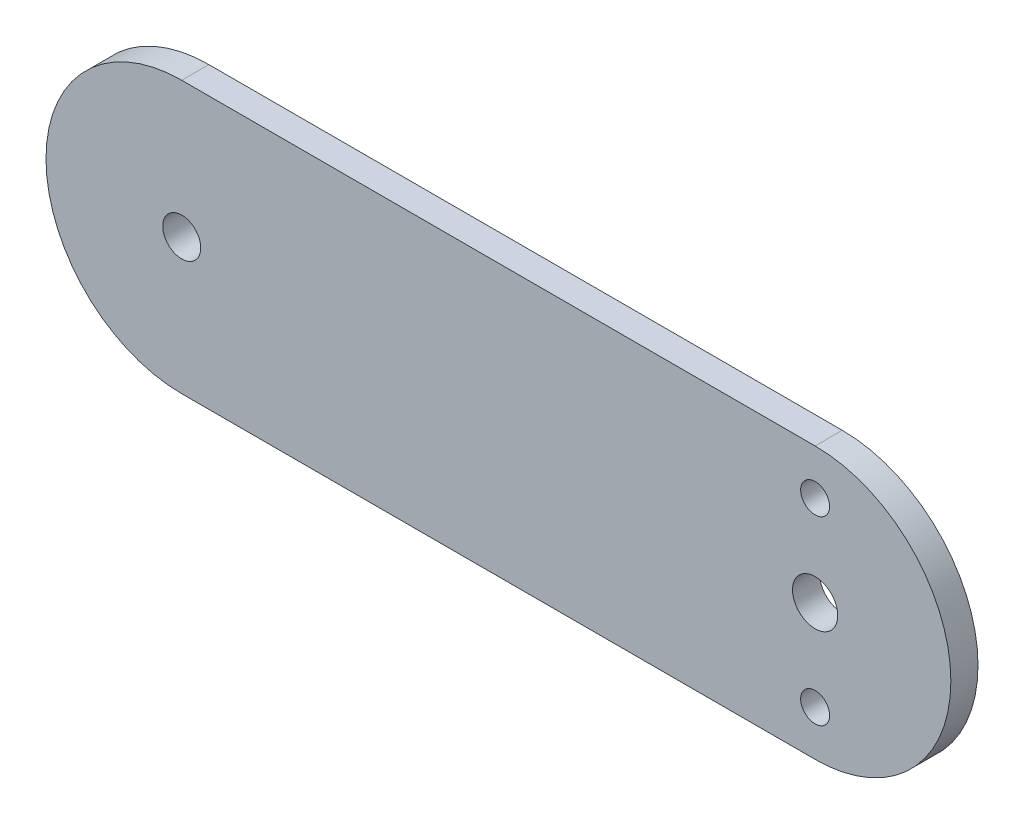
ISO-10303-21;
HEADER;
FILE_DESCRIPTION(('STEP AP214'),'2;1');
FILE_NAME('part.step','',(''),(''),'','','');
FILE_SCHEMA(('AUTOMOTIVE_DESIGN { 1 0 10303 214 1 1 1 1 }'));
ENDSEC;
DATA;
#1=APPLICATION_CONTEXT('core data for automotive mechanical design processes');
#2=APPLICATION_PROTOCOL_DEFINITION('international standard','automotive_design',2000,#1);
#3=PRODUCT_CONTEXT('',#1,'mechanical');
#4=PRODUCT('Part','Part','',(#3));
#5=PRODUCT_RELATED_PRODUCT_CATEGORY('part','',(#4));
#6=PRODUCT_DEFINITION_FORMATION('','',#4);
#7=PRODUCT_DEFINITION_CONTEXT('part definition',#1,'design');
#8=PRODUCT_DEFINITION('design','',#6,#7);
#9=PRODUCT_DEFINITION_SHAPE('','',#8);
#10=(LENGTH_UNIT() NAMED_UNIT(*) SI_UNIT(.MILLI.,.METRE.));
#11=(NAMED_UNIT(*) PLANE_ANGLE_UNIT() SI_UNIT($,.RADIAN.));
#12=(NAMED_UNIT(*) SI_UNIT($,.STERADIAN.) SOLID_ANGLE_UNIT());
#13=UNCERTAINTY_MEASURE_WITH_UNIT(LENGTH_MEASURE(1.E-05),#10,'distance_accuracy_value','');
#14=(GEOMETRIC_REPRESENTATION_CONTEXT(3) GLOBAL_UNCERTAINTY_ASSIGNED_CONTEXT((#13)) GLOBAL_UNIT_ASSIGNED_CONTEXT((#10,
#11,#12)) REPRESENTATION_CONTEXT('',''));
#15=CARTESIAN_POINT('',(0.,0.,0.));
#16=DIRECTION('',(0.,0.,1.));
#17=DIRECTION('',(1.,0.,0.));
#18=AXIS2_PLACEMENT_3D('',#15,#16,#17);
#19=CARTESIAN_POINT('',(35.,0.,3.));
#20=DIRECTION('',(0.,0.,-1.));
#21=DIRECTION('',(-1.,0.,0.));
#22=AXIS2_PLACEMENT_3D('',#19,#20,#21);
#23=PLANE('',#22);
#24=CARTESIAN_POINT('',(35.,10.,3.));
#25=DIRECTION('',(0.,0.,1.));
#26=DIRECTION('',(1.,0.,0.));
#27=AXIS2_PLACEMENT_3D('',#24,#25,#26);
#28=CIRCLE('',#27,1.6);
#29=CARTESIAN_POINT('',(36.6,10.,3.));
#30=VERTEX_POINT('',#29);
#31=EDGE_CURVE('E138',#30,#30,#28,.T.);
#32=ORIENTED_EDGE('',*,*,#31,.F.);
#33=EDGE_LOOP('',(#32));
#34=FACE_BOUND('',#33,.T.);
#35=CARTESIAN_POINT('',(35.,-10.,3.));
#36=DIRECTION('',(0.,0.,1.));
#37=DIRECTION('',(-1.,0.,0.));
#38=AXIS2_PLACEMENT_3D('',#35,#36,#37);
#39=CIRCLE('',#38,1.6);
#40=CARTESIAN_POINT('',(33.4,-10.,3.));
#41=VERTEX_POINT('',#40);
#42=EDGE_CURVE('E135',#41,#41,#39,.T.);
#43=ORIENTED_EDGE('',*,*,#42,.F.);
#44=EDGE_LOOP('',(#43));
#45=FACE_BOUND('',#44,.T.);
#46=CARTESIAN_POINT('',(35.,0.,3.));
#47=DIRECTION('',(0.,0.,1.));
#48=DIRECTION('',(-1.,0.,0.));
#49=AXIS2_PLACEMENT_3D('',#46,#47,#48);
#50=CIRCLE('',#49,15.);
#51=CARTESIAN_POINT('',(35.,-15.,3.));
#52=VERTEX_POINT('',#51);
#53=CARTESIAN_POINT('',(35.,15.,3.));
#54=VERTEX_POINT('',#53);
#55=EDGE_CURVE('E93',#52,#54,#50,.T.);
#56=ORIENTED_EDGE('',*,*,#55,.T.);
#57=DIRECTION('',(-1.,0.,0.));
#58=VECTOR('',#57,1.);
#59=CARTESIAN_POINT('',(-35.,15.,3.));
#60=LINE('',#59,#58);
#61=CARTESIAN_POINT('',(-35.,15.,3.));
#62=VERTEX_POINT('',#61);
#63=EDGE_CURVE('E88',#54,#62,#60,.T.);
#64=ORIENTED_EDGE('',*,*,#63,.T.);
#65=CARTESIAN_POINT('',(-35.,0.,3.));
#66=DIRECTION('',(0.,0.,1.));
#67=DIRECTION('',(1.,0.,0.));
#68=AXIS2_PLACEMENT_3D('',#65,#66,#67);
#69=CIRCLE('',#68,15.);
#70=CARTESIAN_POINT('',(-35.,-15.,3.));
#71=VERTEX_POINT('',#70);
#72=EDGE_CURVE('E91',#62,#71,#69,.T.);
#73=ORIENTED_EDGE('',*,*,#72,.T.);
#74=DIRECTION('',(1.,0.,0.));
#75=VECTOR('',#74,1.);
#76=CARTESIAN_POINT('',(-35.,-15.,3.));
#77=LINE('',#76,#75);
#78=EDGE_CURVE('E58',#71,#52,#77,.T.);
#79=ORIENTED_EDGE('',*,*,#78,.T.);
#80=EDGE_LOOP('',(#56,#64,#73,#79));
#81=FACE_BOUND('',#80,.T.);
#82=CARTESIAN_POINT('',(35.,0.,3.));
#83=DIRECTION('',(0.,0.,1.));
#84=DIRECTION('',(1.,0.,0.));
#85=AXIS2_PLACEMENT_3D('',#82,#83,#84);
#86=CIRCLE('',#85,2.5);
#87=CARTESIAN_POINT('',(37.5,0.,3.));
#88=VERTEX_POINT('',#87);
#89=EDGE_CURVE('E108',#88,#88,#86,.T.);
#90=ORIENTED_EDGE('',*,*,#89,.F.);
#91=EDGE_LOOP('',(#90));
#92=FACE_BOUND('',#91,.T.);
#93=CARTESIAN_POINT('',(-35.,0.,3.));
#94=DIRECTION('',(0.,0.,1.));
#95=DIRECTION('',(1.,0.,0.));
#96=AXIS2_PLACEMENT_3D('',#93,#94,#95);
#97=CIRCLE('',#96,2.1);
#98=CARTESIAN_POINT('',(-32.9,0.,3.));
#99=VERTEX_POINT('',#98);
#100=EDGE_CURVE('E123',#99,#99,#97,.T.);
#101=ORIENTED_EDGE('',*,*,#100,.F.);
#102=EDGE_LOOP('',(#101));
#103=FACE_BOUND('',#102,.T.);
#104=ADVANCED_FACE('F41',(#34,#45,#81,#92,#103),#23,.F.);
#105=CARTESIAN_POINT('',(35.,0.,0.));
#106=DIRECTION('',(0.,0.,-1.));
#107=DIRECTION('',(-1.,0.,0.));
#108=AXIS2_PLACEMENT_3D('',#105,#106,#107);
#109=PLANE('',#108);
#110=CARTESIAN_POINT('',(35.,10.,0.));
#111=DIRECTION('',(0.,0.,1.));
#112=DIRECTION('',(1.,0.,0.));
#113=AXIS2_PLACEMENT_3D('',#110,#111,#112);
#114=CIRCLE('',#113,1.6);
#115=CARTESIAN_POINT('',(36.6,10.,0.));
#116=VERTEX_POINT('',#115);
#117=EDGE_CURVE('E129',#116,#116,#114,.T.);
#118=ORIENTED_EDGE('',*,*,#117,.T.);
#119=EDGE_LOOP('',(#118));
#120=FACE_BOUND('',#119,.T.);
#121=CARTESIAN_POINT('',(35.,-10.,0.));
#122=DIRECTION('',(0.,0.,1.));
#123=DIRECTION('',(-1.,0.,0.));
#124=AXIS2_PLACEMENT_3D('',#121,#122,#123);
#125=CIRCLE('',#124,1.6);
#126=CARTESIAN_POINT('',(33.4,-10.,0.));
#127=VERTEX_POINT('',#126);
#128=EDGE_CURVE('E132',#127,#127,#125,.T.);
#129=ORIENTED_EDGE('',*,*,#128,.T.);
#130=EDGE_LOOP('',(#129));
#131=FACE_BOUND('',#130,.T.);
#132=CARTESIAN_POINT('',(35.,0.,0.));
#133=DIRECTION('',(0.,0.,1.));
#134=DIRECTION('',(1.,0.,0.));
#135=AXIS2_PLACEMENT_3D('',#132,#133,#134);
#136=CIRCLE('',#135,2.5);
#137=CARTESIAN_POINT('',(37.5,0.,0.));
#138=VERTEX_POINT('',#137);
#139=EDGE_CURVE('E120',#138,#138,#136,.T.);
#140=ORIENTED_EDGE('',*,*,#139,.T.);
#141=EDGE_LOOP('',(#140));
#142=FACE_BOUND('',#141,.T.);
#143=CARTESIAN_POINT('',(35.,0.,0.));
#144=DIRECTION('',(0.,0.,1.));
#145=DIRECTION('',(-1.,0.,0.));
#146=AXIS2_PLACEMENT_3D('',#143,#144,#145);
#147=CIRCLE('',#146,15.);
#148=CARTESIAN_POINT('',(35.,-15.,0.));
#149=VERTEX_POINT('',#148);
#150=CARTESIAN_POINT('',(35.,15.,0.));
#151=VERTEX_POINT('',#150);
#152=EDGE_CURVE('E105',#149,#151,#147,.T.);
#153=ORIENTED_EDGE('',*,*,#152,.F.);
#154=DIRECTION('',(1.,0.,0.));
#155=VECTOR('',#154,1.);
#156=CARTESIAN_POINT('',(-35.,-15.,0.));
#157=LINE('',#156,#155);
#158=CARTESIAN_POINT('',(-35.,-15.,0.));
#159=VERTEX_POINT('',#158);
#160=EDGE_CURVE('E81',#159,#149,#157,.T.);
#161=ORIENTED_EDGE('',*,*,#160,.F.);
#162=CARTESIAN_POINT('',(-35.,0.,0.));
#163=DIRECTION('',(0.,0.,1.));
#164=DIRECTION('',(1.,0.,0.));
#165=AXIS2_PLACEMENT_3D('',#162,#163,#164);
#166=CIRCLE('',#165,15.);
#167=CARTESIAN_POINT('',(-35.,15.,0.));
#168=VERTEX_POINT('',#167);
#169=EDGE_CURVE('E75',#168,#159,#166,.T.);
#170=ORIENTED_EDGE('',*,*,#169,.F.);
#171=DIRECTION('',(-1.,0.,0.));
#172=VECTOR('',#171,1.);
#173=CARTESIAN_POINT('',(-35.,15.,0.));
#174=LINE('',#173,#172);
#175=EDGE_CURVE('E97',#151,#168,#174,.T.);
#176=ORIENTED_EDGE('',*,*,#175,.F.);
#177=EDGE_LOOP('',(#153,#161,#170,#176));
#178=FACE_BOUND('',#177,.T.);
#179=CARTESIAN_POINT('',(-35.,0.,0.));
#180=DIRECTION('',(0.,0.,1.));
#181=DIRECTION('',(1.,0.,0.));
#182=AXIS2_PLACEMENT_3D('',#179,#180,#181);
#183=CIRCLE('',#182,2.1);
#184=CARTESIAN_POINT('',(-32.9,0.,0.));
#185=VERTEX_POINT('',#184);
#186=EDGE_CURVE('E126',#185,#185,#183,.T.);
#187=ORIENTED_EDGE('',*,*,#186,.T.);
#188=EDGE_LOOP('',(#187));
#189=FACE_BOUND('',#188,.T.);
#190=ADVANCED_FACE('F116',(#120,#131,#142,#178,#189),#109,.T.);
#191=CARTESIAN_POINT('',(35.,0.,3.));
#192=DIRECTION('',(0.,0.,-1.));
#193=DIRECTION('',(-1.,0.,0.));
#194=AXIS2_PLACEMENT_3D('',#191,#192,#193);
#195=CYLINDRICAL_SURFACE('',#194,15.);
#196=ORIENTED_EDGE('',*,*,#152,.T.);
#197=DIRECTION('',(0.,0.,-1.));
#198=VECTOR('',#197,1.);
#199=CARTESIAN_POINT('',(35.,15.,3.));
#200=LINE('',#199,#198);
#201=EDGE_CURVE('E11',#54,#151,#200,.T.);
#202=ORIENTED_EDGE('',*,*,#201,.F.);
#203=ORIENTED_EDGE('',*,*,#55,.F.);
#204=DIRECTION('',(0.,0.,-1.));
#205=VECTOR('',#204,1.);
#206=CARTESIAN_POINT('',(35.,-15.,3.));
#207=LINE('',#206,#205);
#208=EDGE_CURVE('E101',#52,#149,#207,.T.);
#209=ORIENTED_EDGE('',*,*,#208,.T.);
#210=EDGE_LOOP('',(#196,#202,#203,#209));
#211=FACE_BOUND('',#210,.T.);
#212=ADVANCED_FACE('F43',(#211),#195,.T.);
#213=CARTESIAN_POINT('',(-35.,15.,3.));
#214=DIRECTION('',(0.,-1.,0.));
#215=DIRECTION('',(0.,0.,-1.));
#216=AXIS2_PLACEMENT_3D('',#213,#214,#215);
#217=PLANE('',#216);
#218=ORIENTED_EDGE('',*,*,#175,.T.);
#219=DIRECTION('',(0.,0.,-1.));
#220=VECTOR('',#219,1.);
#221=CARTESIAN_POINT('',(-35.,15.,3.));
#222=LINE('',#221,#220);
#223=EDGE_CURVE('E50',#62,#168,#222,.T.);
#224=ORIENTED_EDGE('',*,*,#223,.F.);
#225=ORIENTED_EDGE('',*,*,#63,.F.);
#226=ORIENTED_EDGE('',*,*,#201,.T.);
#227=EDGE_LOOP('',(#218,#224,#225,#226));
#228=FACE_BOUND('',#227,.T.);
#229=ADVANCED_FACE('F96',(#228),#217,.F.);
#230=CARTESIAN_POINT('',(-35.,0.,3.));
#231=DIRECTION('',(0.,0.,-1.));
#232=DIRECTION('',(-1.,0.,0.));
#233=AXIS2_PLACEMENT_3D('',#230,#231,#232);
#234=CYLINDRICAL_SURFACE('',#233,15.);
#235=ORIENTED_EDGE('',*,*,#169,.T.);
#236=DIRECTION('',(0.,0.,-1.));
#237=VECTOR('',#236,1.);
#238=CARTESIAN_POINT('',(-35.,-15.,3.));
#239=LINE('',#238,#237);
#240=EDGE_CURVE('E98',#71,#159,#239,.T.);
#241=ORIENTED_EDGE('',*,*,#240,.F.);
#242=ORIENTED_EDGE('',*,*,#72,.F.);
#243=ORIENTED_EDGE('',*,*,#223,.T.);
#244=EDGE_LOOP('',(#235,#241,#242,#243));
#245=FACE_BOUND('',#244,.T.);
#246=ADVANCED_FACE('F99',(#245),#234,.T.);
#247=CARTESIAN_POINT('',(-35.,-15.,3.));
#248=DIRECTION('',(0.,1.,0.));
#249=DIRECTION('',(0.,0.,1.));
#250=AXIS2_PLACEMENT_3D('',#247,#248,#249);
#251=PLANE('',#250);
#252=ORIENTED_EDGE('',*,*,#160,.T.);
#253=ORIENTED_EDGE('',*,*,#208,.F.);
#254=ORIENTED_EDGE('',*,*,#78,.F.);
#255=ORIENTED_EDGE('',*,*,#240,.T.);
#256=EDGE_LOOP('',(#252,#253,#254,#255));
#257=FACE_BOUND('',#256,.T.);
#258=ADVANCED_FACE('F113',(#257),#251,.F.);
#259=CARTESIAN_POINT('',(35.,0.,3.));
#260=DIRECTION('',(0.,0.,-1.));
#261=DIRECTION('',(-1.,0.,0.));
#262=AXIS2_PLACEMENT_3D('',#259,#260,#261);
#263=CYLINDRICAL_SURFACE('',#262,2.5);
#264=ORIENTED_EDGE('',*,*,#89,.T.);
#265=EDGE_LOOP('',(#264));
#266=FACE_BOUND('',#265,.T.);
#267=ORIENTED_EDGE('',*,*,#139,.F.);
#268=EDGE_LOOP('',(#267));
#269=FACE_BOUND('',#268,.T.);
#270=ADVANCED_FACE('F165',(#266,#269),#263,.F.);
#271=CARTESIAN_POINT('',(-35.,0.,3.));
#272=DIRECTION('',(0.,0.,-1.));
#273=DIRECTION('',(-1.,0.,0.));
#274=AXIS2_PLACEMENT_3D('',#271,#272,#273);
#275=CYLINDRICAL_SURFACE('',#274,2.1);
#276=ORIENTED_EDGE('',*,*,#100,.T.);
#277=EDGE_LOOP('',(#276));
#278=FACE_BOUND('',#277,.T.);
#279=ORIENTED_EDGE('',*,*,#186,.F.);
#280=EDGE_LOOP('',(#279));
#281=FACE_BOUND('',#280,.T.);
#282=ADVANCED_FACE('F159',(#278,#281),#275,.F.);
#283=CARTESIAN_POINT('',(35.,-10.,0.));
#284=DIRECTION('',(0.,0.,1.));
#285=DIRECTION('',(1.,0.,0.));
#286=AXIS2_PLACEMENT_3D('',#283,#284,#285);
#287=CYLINDRICAL_SURFACE('',#286,1.6);
#288=ORIENTED_EDGE('',*,*,#128,.F.);
#289=EDGE_LOOP('',(#288));
#290=FACE_BOUND('',#289,.T.);
#291=ORIENTED_EDGE('',*,*,#42,.T.);
#292=EDGE_LOOP('',(#291));
#293=FACE_BOUND('',#292,.T.);
#294=ADVANCED_FACE('F149',(#290,#293),#287,.F.);
#295=CARTESIAN_POINT('',(35.,10.,0.));
#296=DIRECTION('',(0.,0.,1.));
#297=DIRECTION('',(1.,0.,0.));
#298=AXIS2_PLACEMENT_3D('',#295,#296,#297);
#299=CYLINDRICAL_SURFACE('',#298,1.6);
#300=ORIENTED_EDGE('',*,*,#117,.F.);
#301=EDGE_LOOP('',(#300));
#302=FACE_BOUND('',#301,.T.);
#303=ORIENTED_EDGE('',*,*,#31,.T.);
#304=EDGE_LOOP('',(#303));
#305=FACE_BOUND('',#304,.T.);
#306=ADVANCED_FACE('F146',(#302,#305),#299,.F.);
#307=CLOSED_SHELL('',(#104,#190,#212,#229,#246,#258,#270,#282,#294,#306));
#308=MANIFOLD_SOLID_BREP('B2',#307);
#309=ADVANCED_BREP_SHAPE_REPRESENTATION('',(#18,#308),#14);
#310=SHAPE_DEFINITION_REPRESENTATION(#9,#309);
ENDSEC;
END-ISO-10303-21;
